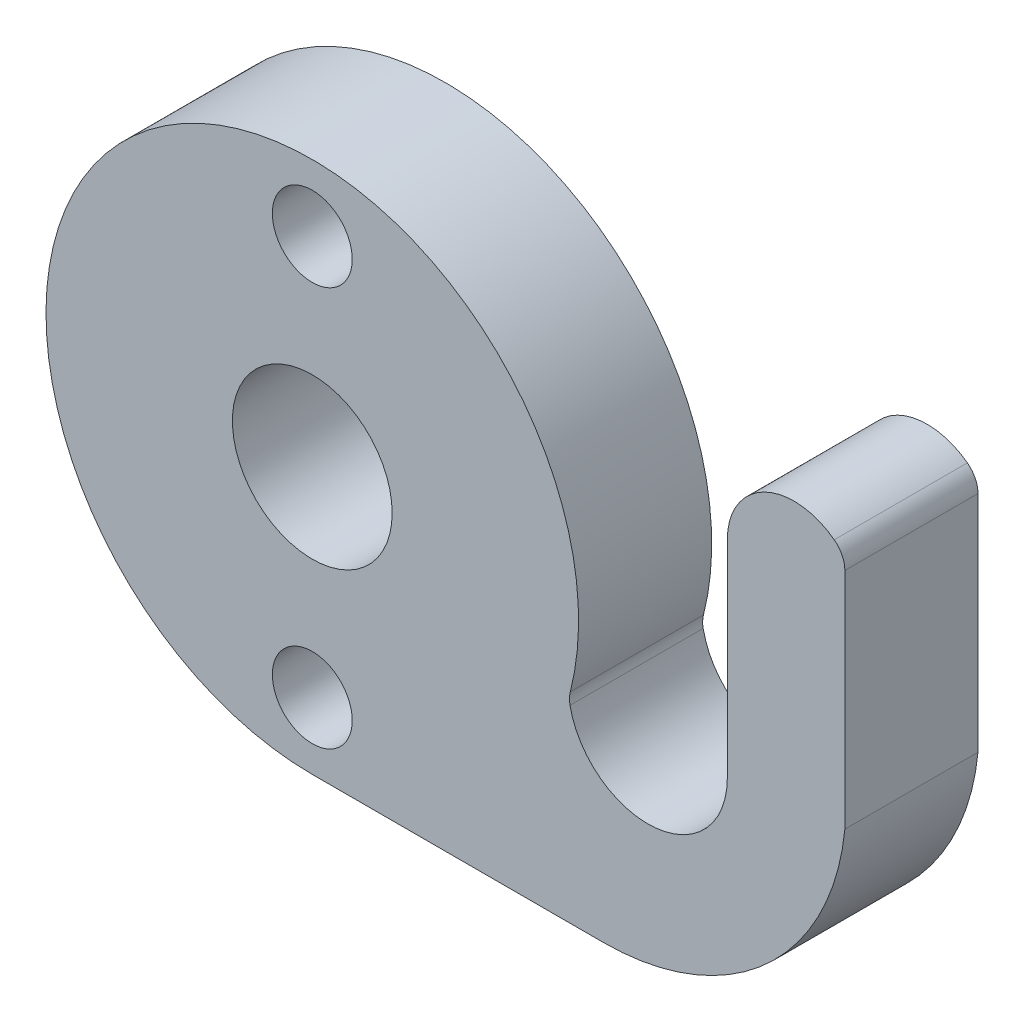
ISO-10303-21;
HEADER;
FILE_DESCRIPTION(('STEP AP214'),'2;1');
FILE_NAME('part.step','',(''),(''),'','','');
FILE_SCHEMA(('AUTOMOTIVE_DESIGN { 1 0 10303 214 1 1 1 1 }'));
ENDSEC;
DATA;
#1=APPLICATION_CONTEXT('core data for automotive mechanical design processes');
#2=APPLICATION_PROTOCOL_DEFINITION('international standard','automotive_design',2000,#1);
#3=PRODUCT_CONTEXT('',#1,'mechanical');
#4=PRODUCT('Part','Part','',(#3));
#5=PRODUCT_RELATED_PRODUCT_CATEGORY('part','',(#4));
#6=PRODUCT_DEFINITION_FORMATION('','',#4);
#7=PRODUCT_DEFINITION_CONTEXT('part definition',#1,'design');
#8=PRODUCT_DEFINITION('design','',#6,#7);
#9=PRODUCT_DEFINITION_SHAPE('','',#8);
#10=(LENGTH_UNIT() NAMED_UNIT(*) SI_UNIT(.MILLI.,.METRE.));
#11=(NAMED_UNIT(*) PLANE_ANGLE_UNIT() SI_UNIT($,.RADIAN.));
#12=(NAMED_UNIT(*) SI_UNIT($,.STERADIAN.) SOLID_ANGLE_UNIT());
#13=UNCERTAINTY_MEASURE_WITH_UNIT(LENGTH_MEASURE(1.E-05),#10,'distance_accuracy_value','');
#14=(GEOMETRIC_REPRESENTATION_CONTEXT(3) GLOBAL_UNCERTAINTY_ASSIGNED_CONTEXT((#13)) GLOBAL_UNIT_ASSIGNED_CONTEXT((#10,
#11,#12)) REPRESENTATION_CONTEXT('',''));
#15=CARTESIAN_POINT('',(0.,0.,0.));
#16=DIRECTION('',(0.,0.,1.));
#17=DIRECTION('',(1.,0.,0.));
#18=AXIS2_PLACEMENT_3D('',#15,#16,#17);
#19=CARTESIAN_POINT('',(13.0936915177612,5.42804178172931,5.));
#20=DIRECTION('',(0.,0.,-1.));
#21=DIRECTION('',(-1.,0.,0.));
#22=AXIS2_PLACEMENT_3D('',#19,#20,#21);
#23=CYLINDRICAL_SURFACE('',#22,2.50770351609048);
#24=CARTESIAN_POINT('',(13.0936915177612,5.42804178172931,5.));
#25=DIRECTION('',(0.,0.,1.));
#26=DIRECTION('',(1.,0.,0.));
#27=AXIS2_PLACEMENT_3D('',#24,#25,#26);
#28=CIRCLE('',#27,2.50770351609048);
#29=CARTESIAN_POINT('',(10.5859880016707,5.42804178172931,5.));
#30=VERTEX_POINT('',#29);
#31=CARTESIAN_POINT('',(14.6011185041134,7.43209787012341,5.));
#32=VERTEX_POINT('',#31);
#33=EDGE_CURVE('E110',#30,#32,#28,.F.);
#34=ORIENTED_EDGE('',*,*,#33,.T.);
#35=DIRECTION('',(0.,0.,-1.));
#36=VECTOR('',#35,1.);
#37=CARTESIAN_POINT('',(14.6011185041134,7.43209787012341,5.));
#38=LINE('',#37,#36);
#39=CARTESIAN_POINT('',(14.6011185041134,7.43209787012341,0.));
#40=VERTEX_POINT('',#39);
#41=EDGE_CURVE('E118',#32,#40,#38,.T.);
#42=ORIENTED_EDGE('',*,*,#41,.T.);
#43=CARTESIAN_POINT('',(13.0936915177612,5.42804178172931,0.));
#44=DIRECTION('',(0.,0.,1.));
#45=DIRECTION('',(1.,0.,0.));
#46=AXIS2_PLACEMENT_3D('',#43,#44,#45);
#47=CIRCLE('',#46,2.50770351609048);
#48=CARTESIAN_POINT('',(10.5859880016707,5.42804178172931,0.));
#49=VERTEX_POINT('',#48);
#50=EDGE_CURVE('E113',#49,#40,#47,.F.);
#51=ORIENTED_EDGE('',*,*,#50,.F.);
#52=DIRECTION('',(0.,0.,-1.));
#53=VECTOR('',#52,1.);
#54=CARTESIAN_POINT('',(10.5859880016707,5.42804178172931,5.));
#55=LINE('',#54,#53);
#56=EDGE_CURVE('E107',#30,#49,#55,.T.);
#57=ORIENTED_EDGE('',*,*,#56,.F.);
#58=EDGE_LOOP('',(#34,#42,#51,#57));
#59=FACE_BOUND('',#58,.T.);
#60=ADVANCED_FACE('F38',(#59),#23,.T.);
#61=CARTESIAN_POINT('',(10.5859880016707,0.,5.));
#62=DIRECTION('',(-1.,0.,0.));
#63=DIRECTION('',(0.,0.,1.));
#64=AXIS2_PLACEMENT_3D('',#61,#62,#63);
#65=PLANE('',#64);
#66=DIRECTION('',(0.,1.,0.));
#67=VECTOR('',#66,1.);
#68=CARTESIAN_POINT('',(10.5859880016707,0.,0.));
#69=LINE('',#68,#67);
#70=CARTESIAN_POINT('',(10.5859880016707,-2.32630362074113,0.));
#71=VERTEX_POINT('',#70);
#72=EDGE_CURVE('E159',#71,#49,#69,.T.);
#73=ORIENTED_EDGE('',*,*,#72,.F.);
#74=DIRECTION('',(0.,0.,-1.));
#75=VECTOR('',#74,1.);
#76=CARTESIAN_POINT('',(10.5859880016707,-2.32630362074113,5.));
#77=LINE('',#76,#75);
#78=CARTESIAN_POINT('',(10.5859880016707,-2.32630362074113,5.));
#79=VERTEX_POINT('',#78);
#80=EDGE_CURVE('E119',#79,#71,#77,.T.);
#81=ORIENTED_EDGE('',*,*,#80,.F.);
#82=DIRECTION('',(0.,1.,0.));
#83=VECTOR('',#82,1.);
#84=CARTESIAN_POINT('',(10.5859880016707,0.,5.));
#85=LINE('',#84,#83);
#86=EDGE_CURVE('E125',#79,#30,#85,.T.);
#87=ORIENTED_EDGE('',*,*,#86,.T.);
#88=ORIENTED_EDGE('',*,*,#56,.T.);
#89=EDGE_LOOP('',(#73,#81,#87,#88));
#90=FACE_BOUND('',#89,.T.);
#91=ADVANCED_FACE('F131',(#90),#65,.T.);
#92=CARTESIAN_POINT('',(7.60354746225897,-2.32630362074113,5.));
#93=DIRECTION('',(0.,0.,-1.));
#94=DIRECTION('',(-1.,0.,0.));
#95=AXIS2_PLACEMENT_3D('',#92,#93,#94);
#96=CYLINDRICAL_SURFACE('',#95,2.98244053941171);
#97=CARTESIAN_POINT('',(7.60354746225897,-2.32630362074113,0.));
#98=DIRECTION('',(0.,0.,1.));
#99=DIRECTION('',(1.,0.,0.));
#100=AXIS2_PLACEMENT_3D('',#97,#98,#99);
#101=CIRCLE('',#100,2.98244053941171);
#102=CARTESIAN_POINT('',(4.67905818988536,-2.91137974134262,0.));
#103=VERTEX_POINT('',#102);
#104=EDGE_CURVE('E161',#103,#71,#101,.T.);
#105=ORIENTED_EDGE('',*,*,#104,.F.);
#106=DIRECTION('',(0.,0.,-1.));
#107=VECTOR('',#106,1.);
#108=CARTESIAN_POINT('',(4.67905818988536,-2.91137974134262,5.));
#109=LINE('',#108,#107);
#110=CARTESIAN_POINT('',(4.67905818988536,-2.91137974134262,5.));
#111=VERTEX_POINT('',#110);
#112=EDGE_CURVE('E53',#103,#111,#109,.F.);
#113=ORIENTED_EDGE('',*,*,#112,.T.);
#114=CARTESIAN_POINT('',(7.60354746225897,-2.32630362074113,5.));
#115=DIRECTION('',(0.,0.,1.));
#116=DIRECTION('',(1.,0.,0.));
#117=AXIS2_PLACEMENT_3D('',#114,#115,#116);
#118=CIRCLE('',#117,2.98244053941171);
#119=EDGE_CURVE('E133',#111,#79,#118,.T.);
#120=ORIENTED_EDGE('',*,*,#119,.T.);
#121=ORIENTED_EDGE('',*,*,#80,.T.);
#122=EDGE_LOOP('',(#105,#113,#120,#121));
#123=FACE_BOUND('',#122,.T.);
#124=ADVANCED_FACE('F217',(#123),#96,.F.);
#125=CARTESIAN_POINT('',(-5.,0.,5.));
#126=DIRECTION('',(0.,0.,-1.));
#127=DIRECTION('',(-1.,0.,0.));
#128=AXIS2_PLACEMENT_3D('',#125,#126,#127);
#129=CYLINDRICAL_SURFACE('',#128,10.);
#130=CARTESIAN_POINT('',(-5.,0.,5.));
#131=DIRECTION('',(0.,0.,1.));
#132=DIRECTION('',(1.,0.,0.));
#133=AXIS2_PLACEMENT_3D('',#130,#131,#132);
#134=CIRCLE('',#133,10.);
#135=CARTESIAN_POINT('',(4.69057033572414,-2.46836921233095,5.));
#136=VERTEX_POINT('',#135);
#137=CARTESIAN_POINT('',(-5.,-10.,5.));
#138=VERTEX_POINT('',#137);
#139=EDGE_CURVE('E135',#136,#138,#134,.T.);
#140=ORIENTED_EDGE('',*,*,#139,.F.);
#141=DIRECTION('',(0.,0.,-1.));
#142=VECTOR('',#141,1.);
#143=CARTESIAN_POINT('',(4.69057033572414,-2.46836921233095,5.));
#144=LINE('',#143,#142);
#145=CARTESIAN_POINT('',(4.69057033572414,-2.46836921233095,0.));
#146=VERTEX_POINT('',#145);
#147=EDGE_CURVE('E189',#136,#146,#144,.T.);
#148=ORIENTED_EDGE('',*,*,#147,.T.);
#149=CARTESIAN_POINT('',(-5.,0.,0.));
#150=DIRECTION('',(0.,0.,1.));
#151=DIRECTION('',(1.,0.,0.));
#152=AXIS2_PLACEMENT_3D('',#149,#150,#151);
#153=CIRCLE('',#152,10.);
#154=CARTESIAN_POINT('',(-5.,-10.,0.));
#155=VERTEX_POINT('',#154);
#156=EDGE_CURVE('E163',#146,#155,#153,.T.);
#157=ORIENTED_EDGE('',*,*,#156,.T.);
#158=DIRECTION('',(0.,0.,-1.));
#159=VECTOR('',#158,1.);
#160=CARTESIAN_POINT('',(-5.,-10.,5.));
#161=LINE('',#160,#159);
#162=EDGE_CURVE('E179',#138,#155,#161,.T.);
#163=ORIENTED_EDGE('',*,*,#162,.F.);
#164=EDGE_LOOP('',(#140,#148,#157,#163));
#165=FACE_BOUND('',#164,.T.);
#166=ADVANCED_FACE('F195',(#165),#129,.T.);
#167=CARTESIAN_POINT('',(0.,-10.,5.));
#168=DIRECTION('',(0.,1.,0.));
#169=DIRECTION('',(0.,0.,1.));
#170=AXIS2_PLACEMENT_3D('',#167,#168,#169);
#171=PLANE('',#170);
#172=DIRECTION('',(1.,0.,0.));
#173=VECTOR('',#172,1.);
#174=CARTESIAN_POINT('',(0.,-10.,0.));
#175=LINE('',#174,#173);
#176=CARTESIAN_POINT('',(5.93338076018841,-10.,0.));
#177=VERTEX_POINT('',#176);
#178=EDGE_CURVE('E165',#155,#177,#175,.T.);
#179=ORIENTED_EDGE('',*,*,#178,.T.);
#180=DIRECTION('',(0.,0.,-1.));
#181=VECTOR('',#180,1.);
#182=CARTESIAN_POINT('',(5.93338076018841,-10.,5.));
#183=LINE('',#182,#181);
#184=CARTESIAN_POINT('',(5.93338076018841,-10.,5.));
#185=VERTEX_POINT('',#184);
#186=EDGE_CURVE('E176',#185,#177,#183,.T.);
#187=ORIENTED_EDGE('',*,*,#186,.F.);
#188=DIRECTION('',(1.,0.,0.));
#189=VECTOR('',#188,1.);
#190=CARTESIAN_POINT('',(0.,-10.,5.));
#191=LINE('',#190,#189);
#192=EDGE_CURVE('E140',#138,#185,#191,.T.);
#193=ORIENTED_EDGE('',*,*,#192,.F.);
#194=ORIENTED_EDGE('',*,*,#162,.T.);
#195=EDGE_LOOP('',(#179,#187,#193,#194));
#196=FACE_BOUND('',#195,.T.);
#197=ADVANCED_FACE('F204',(#196),#171,.F.);
#198=CARTESIAN_POINT('',(5.93338076018841,-0.889820778013908,5.));
#199=DIRECTION('',(0.,0.,-1.));
#200=DIRECTION('',(-1.,0.,0.));
#201=AXIS2_PLACEMENT_3D('',#198,#199,#200);
#202=CYLINDRICAL_SURFACE('',#201,9.11017922198609);
#203=CARTESIAN_POINT('',(5.93338076018841,-0.889820778013908,0.));
#204=DIRECTION('',(0.,0.,1.));
#205=DIRECTION('',(1.,0.,0.));
#206=AXIS2_PLACEMENT_3D('',#203,#204,#205);
#207=CIRCLE('',#206,9.11017922198609);
#208=CARTESIAN_POINT('',(15.,-1.77964155602783,0.));
#209=VERTEX_POINT('',#208);
#210=EDGE_CURVE('E168',#177,#209,#207,.T.);
#211=ORIENTED_EDGE('',*,*,#210,.T.);
#212=DIRECTION('',(0.,0.,-1.));
#213=VECTOR('',#212,1.);
#214=CARTESIAN_POINT('',(15.,-1.77964155602783,5.));
#215=LINE('',#214,#213);
#216=CARTESIAN_POINT('',(15.,-1.77964155602783,5.));
#217=VERTEX_POINT('',#216);
#218=EDGE_CURVE('E148',#217,#209,#215,.T.);
#219=ORIENTED_EDGE('',*,*,#218,.F.);
#220=CARTESIAN_POINT('',(5.93338076018841,-0.889820778013908,5.));
#221=DIRECTION('',(0.,0.,1.));
#222=DIRECTION('',(1.,0.,0.));
#223=AXIS2_PLACEMENT_3D('',#220,#221,#222);
#224=CIRCLE('',#223,9.11017922198609);
#225=EDGE_CURVE('E143',#185,#217,#224,.T.);
#226=ORIENTED_EDGE('',*,*,#225,.F.);
#227=ORIENTED_EDGE('',*,*,#186,.T.);
#228=EDGE_LOOP('',(#211,#219,#226,#227));
#229=FACE_BOUND('',#228,.T.);
#230=ADVANCED_FACE('F225',(#229),#202,.T.);
#231=CARTESIAN_POINT('',(-5.,0.,5.));
#232=DIRECTION('',(0.,0.,-1.));
#233=DIRECTION('',(-1.,0.,0.));
#234=AXIS2_PLACEMENT_3D('',#231,#232,#233);
#235=CYLINDRICAL_SURFACE('',#234,3.);
#236=CARTESIAN_POINT('',(-5.,0.,5.));
#237=DIRECTION('',(0.,0.,1.));
#238=DIRECTION('',(1.,0.,0.));
#239=AXIS2_PLACEMENT_3D('',#236,#237,#238);
#240=CIRCLE('',#239,3.);
#241=CARTESIAN_POINT('',(-2.,0.,5.));
#242=VERTEX_POINT('',#241);
#243=EDGE_CURVE('E128',#242,#242,#240,.T.);
#244=ORIENTED_EDGE('',*,*,#243,.T.);
#245=EDGE_LOOP('',(#244));
#246=FACE_BOUND('',#245,.T.);
#247=CARTESIAN_POINT('',(-5.,0.,0.));
#248=DIRECTION('',(0.,0.,1.));
#249=DIRECTION('',(1.,0.,0.));
#250=AXIS2_PLACEMENT_3D('',#247,#248,#249);
#251=CIRCLE('',#250,3.);
#252=CARTESIAN_POINT('',(-2.,0.,0.));
#253=VERTEX_POINT('',#252);
#254=EDGE_CURVE('E155',#253,#253,#251,.T.);
#255=ORIENTED_EDGE('',*,*,#254,.F.);
#256=EDGE_LOOP('',(#255));
#257=FACE_BOUND('',#256,.T.);
#258=ADVANCED_FACE('F221',(#246,#257),#235,.F.);
#259=CARTESIAN_POINT('',(-5.,7.5,5.));
#260=DIRECTION('',(0.,0.,-1.));
#261=DIRECTION('',(-1.,0.,0.));
#262=AXIS2_PLACEMENT_3D('',#259,#260,#261);
#263=CYLINDRICAL_SURFACE('',#262,1.5);
#264=CARTESIAN_POINT('',(-5.,7.5,5.));
#265=DIRECTION('',(0.,0.,1.));
#266=DIRECTION('',(1.,0.,0.));
#267=AXIS2_PLACEMENT_3D('',#264,#265,#266);
#268=CIRCLE('',#267,1.5);
#269=CARTESIAN_POINT('',(-3.5,7.5,5.));
#270=VERTEX_POINT('',#269);
#271=EDGE_CURVE('E353',#270,#270,#268,.T.);
#272=ORIENTED_EDGE('',*,*,#271,.T.);
#273=EDGE_LOOP('',(#272));
#274=FACE_BOUND('',#273,.T.);
#275=CARTESIAN_POINT('',(-5.,7.5,0.));
#276=DIRECTION('',(0.,0.,1.));
#277=DIRECTION('',(1.,0.,0.));
#278=AXIS2_PLACEMENT_3D('',#275,#276,#277);
#279=CIRCLE('',#278,1.5);
#280=CARTESIAN_POINT('',(-3.5,7.5,0.));
#281=VERTEX_POINT('',#280);
#282=EDGE_CURVE('E152',#281,#281,#279,.T.);
#283=ORIENTED_EDGE('',*,*,#282,.F.);
#284=EDGE_LOOP('',(#283));
#285=FACE_BOUND('',#284,.T.);
#286=ADVANCED_FACE('F224',(#274,#285),#263,.F.);
#287=CARTESIAN_POINT('',(-5.,-7.5,5.));
#288=DIRECTION('',(0.,0.,-1.));
#289=DIRECTION('',(-1.,0.,0.));
#290=AXIS2_PLACEMENT_3D('',#287,#288,#289);
#291=CYLINDRICAL_SURFACE('',#290,1.5);
#292=CARTESIAN_POINT('',(-5.,-7.5,5.));
#293=DIRECTION('',(0.,0.,1.));
#294=DIRECTION('',(1.,0.,0.));
#295=AXIS2_PLACEMENT_3D('',#292,#293,#294);
#296=CIRCLE('',#295,1.5);
#297=CARTESIAN_POINT('',(-3.5,-7.5,5.));
#298=VERTEX_POINT('',#297);
#299=EDGE_CURVE('E173',#298,#298,#296,.T.);
#300=ORIENTED_EDGE('',*,*,#299,.T.);
#301=EDGE_LOOP('',(#300));
#302=FACE_BOUND('',#301,.T.);
#303=CARTESIAN_POINT('',(-5.,-7.5,0.));
#304=DIRECTION('',(0.,0.,1.));
#305=DIRECTION('',(1.,0.,0.));
#306=AXIS2_PLACEMENT_3D('',#303,#304,#305);
#307=CIRCLE('',#306,1.5);
#308=CARTESIAN_POINT('',(-3.5,-7.5,0.));
#309=VERTEX_POINT('',#308);
#310=EDGE_CURVE('E149',#309,#309,#307,.T.);
#311=ORIENTED_EDGE('',*,*,#310,.F.);
#312=EDGE_LOOP('',(#311));
#313=FACE_BOUND('',#312,.T.);
#314=ADVANCED_FACE('F229',(#302,#313),#291,.F.);
#315=CARTESIAN_POINT('',(15.,0.,5.));
#316=DIRECTION('',(1.,0.,0.));
#317=DIRECTION('',(0.,0.,-1.));
#318=AXIS2_PLACEMENT_3D('',#315,#316,#317);
#319=PLANE('',#318);
#320=DIRECTION('',(0.,-1.,0.));
#321=VECTOR('',#320,1.);
#322=CARTESIAN_POINT('',(15.,0.,0.));
#323=LINE('',#322,#321);
#324=CARTESIAN_POINT('',(15.,6.63293797122179,0.));
#325=VERTEX_POINT('',#324);
#326=EDGE_CURVE('E171',#325,#209,#323,.T.);
#327=ORIENTED_EDGE('',*,*,#326,.F.);
#328=DIRECTION('',(0.,0.,-1.));
#329=VECTOR('',#328,1.);
#330=CARTESIAN_POINT('',(15.,6.63293797122179,5.));
#331=LINE('',#330,#329);
#332=CARTESIAN_POINT('',(15.,6.63293797122179,5.));
#333=VERTEX_POINT('',#332);
#334=EDGE_CURVE('E186',#325,#333,#331,.F.);
#335=ORIENTED_EDGE('',*,*,#334,.T.);
#336=DIRECTION('',(0.,-1.,0.));
#337=VECTOR('',#336,1.);
#338=CARTESIAN_POINT('',(15.,0.,5.));
#339=LINE('',#338,#337);
#340=EDGE_CURVE('E146',#333,#217,#339,.T.);
#341=ORIENTED_EDGE('',*,*,#340,.T.);
#342=ORIENTED_EDGE('',*,*,#218,.T.);
#343=EDGE_LOOP('',(#327,#335,#341,#342));
#344=FACE_BOUND('',#343,.T.);
#345=ADVANCED_FACE('F232',(#344),#319,.T.);
#346=CARTESIAN_POINT('',(0.,0.,5.));
#347=DIRECTION('',(0.,0.,1.));
#348=DIRECTION('',(1.,0.,0.));
#349=AXIS2_PLACEMENT_3D('',#346,#347,#348);
#350=PLANE('',#349);
#351=ORIENTED_EDGE('',*,*,#299,.F.);
#352=EDGE_LOOP('',(#351));
#353=FACE_BOUND('',#352,.T.);
#354=ORIENTED_EDGE('',*,*,#271,.F.);
#355=EDGE_LOOP('',(#354));
#356=FACE_BOUND('',#355,.T.);
#357=ORIENTED_EDGE('',*,*,#243,.F.);
#358=EDGE_LOOP('',(#357));
#359=FACE_BOUND('',#358,.T.);
#360=ORIENTED_EDGE('',*,*,#340,.F.);
#361=CARTESIAN_POINT('',(14.,6.63293797122179,5.));
#362=DIRECTION('',(0.,0.,1.));
#363=DIRECTION('',(1.,0.,0.));
#364=AXIS2_PLACEMENT_3D('',#361,#362,#363);
#365=CIRCLE('',#364,1.);
#366=EDGE_CURVE('E127',#333,#32,#365,.T.);
#367=ORIENTED_EDGE('',*,*,#366,.T.);
#368=ORIENTED_EDGE('',*,*,#33,.F.);
#369=ORIENTED_EDGE('',*,*,#86,.F.);
#370=ORIENTED_EDGE('',*,*,#119,.F.);
#371=CARTESIAN_POINT('',(5.65962736929656,-2.71520613356404,5.));
#372=DIRECTION('',(0.,0.,1.));
#373=DIRECTION('',(1.,0.,0.));
#374=AXIS2_PLACEMENT_3D('',#371,#372,#373);
#375=CIRCLE('',#374,1.);
#376=EDGE_CURVE('E12',#111,#136,#375,.F.);
#377=ORIENTED_EDGE('',*,*,#376,.T.);
#378=ORIENTED_EDGE('',*,*,#139,.T.);
#379=ORIENTED_EDGE('',*,*,#192,.T.);
#380=ORIENTED_EDGE('',*,*,#225,.T.);
#381=EDGE_LOOP('',(#360,#367,#368,#369,#370,#377,#378,#379,#380));
#382=FACE_BOUND('',#381,.T.);
#383=ADVANCED_FACE('F124',(#353,#356,#359,#382),#350,.T.);
#384=CARTESIAN_POINT('',(0.,0.,0.));
#385=DIRECTION('',(0.,0.,1.));
#386=DIRECTION('',(1.,0.,0.));
#387=AXIS2_PLACEMENT_3D('',#384,#385,#386);
#388=PLANE('',#387);
#389=ORIENTED_EDGE('',*,*,#310,.T.);
#390=EDGE_LOOP('',(#389));
#391=FACE_BOUND('',#390,.T.);
#392=ORIENTED_EDGE('',*,*,#282,.T.);
#393=EDGE_LOOP('',(#392));
#394=FACE_BOUND('',#393,.T.);
#395=ORIENTED_EDGE('',*,*,#254,.T.);
#396=EDGE_LOOP('',(#395));
#397=FACE_BOUND('',#396,.T.);
#398=ORIENTED_EDGE('',*,*,#50,.T.);
#399=CARTESIAN_POINT('',(14.,6.63293797122179,0.));
#400=DIRECTION('',(0.,0.,1.));
#401=DIRECTION('',(1.,0.,0.));
#402=AXIS2_PLACEMENT_3D('',#399,#400,#401);
#403=CIRCLE('',#402,1.);
#404=EDGE_CURVE('E184',#40,#325,#403,.F.);
#405=ORIENTED_EDGE('',*,*,#404,.T.);
#406=ORIENTED_EDGE('',*,*,#326,.T.);
#407=ORIENTED_EDGE('',*,*,#210,.F.);
#408=ORIENTED_EDGE('',*,*,#178,.F.);
#409=ORIENTED_EDGE('',*,*,#156,.F.);
#410=CARTESIAN_POINT('',(5.65962736929656,-2.71520613356404,0.));
#411=DIRECTION('',(0.,0.,1.));
#412=DIRECTION('',(1.,0.,0.));
#413=AXIS2_PLACEMENT_3D('',#410,#411,#412);
#414=CIRCLE('',#413,1.);
#415=EDGE_CURVE('E46',#146,#103,#414,.T.);
#416=ORIENTED_EDGE('',*,*,#415,.T.);
#417=ORIENTED_EDGE('',*,*,#104,.T.);
#418=ORIENTED_EDGE('',*,*,#72,.T.);
#419=EDGE_LOOP('',(#398,#405,#406,#407,#408,#409,#416,#417,#418));
#420=FACE_BOUND('',#419,.T.);
#421=ADVANCED_FACE('F200',(#391,#394,#397,#420),#388,.F.);
#422=CARTESIAN_POINT('',(14.,6.63293797122179,5.));
#423=DIRECTION('',(0.,0.,-1.));
#424=DIRECTION('',(-1.,0.,0.));
#425=AXIS2_PLACEMENT_3D('',#422,#423,#424);
#426=CYLINDRICAL_SURFACE('',#425,1.);
#427=ORIENTED_EDGE('',*,*,#366,.F.);
#428=ORIENTED_EDGE('',*,*,#334,.F.);
#429=ORIENTED_EDGE('',*,*,#404,.F.);
#430=ORIENTED_EDGE('',*,*,#41,.F.);
#431=EDGE_LOOP('',(#427,#428,#429,#430));
#432=FACE_BOUND('',#431,.T.);
#433=ADVANCED_FACE('F207',(#432),#426,.T.);
#434=CARTESIAN_POINT('',(5.65962736929656,-2.71520613356404,5.));
#435=DIRECTION('',(0.,0.,-1.));
#436=DIRECTION('',(-1.,0.,0.));
#437=AXIS2_PLACEMENT_3D('',#434,#435,#436);
#438=CYLINDRICAL_SURFACE('',#437,1.);
#439=ORIENTED_EDGE('',*,*,#376,.F.);
#440=ORIENTED_EDGE('',*,*,#112,.F.);
#441=ORIENTED_EDGE('',*,*,#415,.F.);
#442=ORIENTED_EDGE('',*,*,#147,.F.);
#443=EDGE_LOOP('',(#439,#440,#441,#442));
#444=FACE_BOUND('',#443,.T.);
#445=ADVANCED_FACE('F40',(#444),#438,.F.);
#446=CLOSED_SHELL('',(#60,#91,#124,#166,#197,#230,#258,#286,#314,#345,#383,#421,#433,#445));
#447=MANIFOLD_SOLID_BREP('B2',#446);
#448=ADVANCED_BREP_SHAPE_REPRESENTATION('',(#18,#447),#14);
#449=SHAPE_DEFINITION_REPRESENTATION(#9,#448);
ENDSEC;
END-ISO-10303-21;
